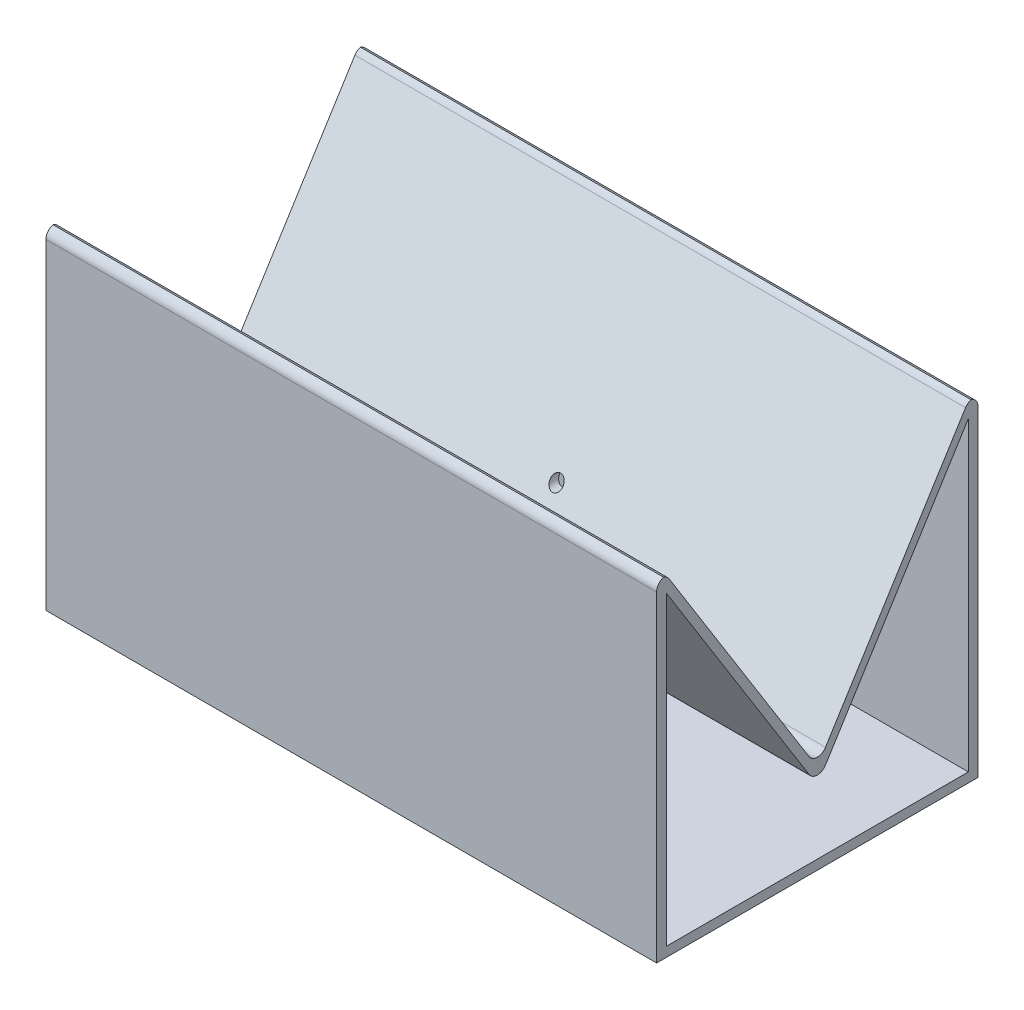
ISO-10303-21;
HEADER;
FILE_DESCRIPTION(('STEP AP214'),'2;1');
FILE_NAME('part.step','',(''),(''),'','','');
FILE_SCHEMA(('AUTOMOTIVE_DESIGN { 1 0 10303 214 1 1 1 1 }'));
ENDSEC;
DATA;
#1=APPLICATION_CONTEXT('core data for automotive mechanical design processes');
#2=APPLICATION_PROTOCOL_DEFINITION('international standard','automotive_design',2000,#1);
#3=PRODUCT_CONTEXT('',#1,'mechanical');
#4=PRODUCT('Part','Part','',(#3));
#5=PRODUCT_RELATED_PRODUCT_CATEGORY('part','',(#4));
#6=PRODUCT_DEFINITION_FORMATION('','',#4);
#7=PRODUCT_DEFINITION_CONTEXT('part definition',#1,'design');
#8=PRODUCT_DEFINITION('design','',#6,#7);
#9=PRODUCT_DEFINITION_SHAPE('','',#8);
#10=(LENGTH_UNIT() NAMED_UNIT(*) SI_UNIT(.MILLI.,.METRE.));
#11=(NAMED_UNIT(*) PLANE_ANGLE_UNIT() SI_UNIT($,.RADIAN.));
#12=(NAMED_UNIT(*) SI_UNIT($,.STERADIAN.) SOLID_ANGLE_UNIT());
#13=UNCERTAINTY_MEASURE_WITH_UNIT(LENGTH_MEASURE(1.E-05),#10,'distance_accuracy_value','');
#14=(GEOMETRIC_REPRESENTATION_CONTEXT(3) GLOBAL_UNCERTAINTY_ASSIGNED_CONTEXT((#13)) GLOBAL_UNIT_ASSIGNED_CONTEXT((#10,
#11,#12)) REPRESENTATION_CONTEXT('',''));
#15=CARTESIAN_POINT('',(0.,0.,0.));
#16=DIRECTION('',(0.,0.,1.));
#17=DIRECTION('',(1.,0.,0.));
#18=AXIS2_PLACEMENT_3D('',#15,#16,#17);
#19=CARTESIAN_POINT('',(0.,3.,0.));
#20=DIRECTION('',(0.,-1.,0.));
#21=DIRECTION('',(0.,0.,-1.));
#22=AXIS2_PLACEMENT_3D('',#19,#20,#21);
#23=PLANE('',#22);
#24=DIRECTION('',(1.,0.,0.));
#25=VECTOR('',#24,1.);
#26=CARTESIAN_POINT('',(-95.,2.99999999999999,-47.));
#27=LINE('',#26,#25);
#28=CARTESIAN_POINT('',(-95.,3.,-47.));
#29=VERTEX_POINT('',#28);
#30=CARTESIAN_POINT('',(95.,3.,-47.));
#31=VERTEX_POINT('',#30);
#32=EDGE_CURVE('E210',#29,#31,#27,.T.);
#33=ORIENTED_EDGE('',*,*,#32,.F.);
#34=DIRECTION('',(0.,0.,1.));
#35=VECTOR('',#34,1.);
#36=CARTESIAN_POINT('',(-95.,3.,50.));
#37=LINE('',#36,#35);
#38=CARTESIAN_POINT('',(-95.,3.,47.));
#39=VERTEX_POINT('',#38);
#40=EDGE_CURVE('E161',#29,#39,#37,.T.);
#41=ORIENTED_EDGE('',*,*,#40,.T.);
#42=DIRECTION('',(1.,0.,0.));
#43=VECTOR('',#42,1.);
#44=CARTESIAN_POINT('',(-95.,3.,47.));
#45=LINE('',#44,#43);
#46=CARTESIAN_POINT('',(95.,3.,47.));
#47=VERTEX_POINT('',#46);
#48=EDGE_CURVE('E165',#39,#47,#45,.T.);
#49=ORIENTED_EDGE('',*,*,#48,.T.);
#50=DIRECTION('',(0.,0.,-1.));
#51=VECTOR('',#50,1.);
#52=CARTESIAN_POINT('',(95.,3.,50.));
#53=LINE('',#52,#51);
#54=EDGE_CURVE('E148',#47,#31,#53,.T.);
#55=ORIENTED_EDGE('',*,*,#54,.T.);
#56=EDGE_LOOP('',(#33,#41,#49,#55));
#57=FACE_BOUND('',#56,.T.);
#58=ADVANCED_FACE('F35',(#57),#23,.F.);
#59=CARTESIAN_POINT('',(95.,3.,50.));
#60=DIRECTION('',(-1.,0.,0.));
#61=DIRECTION('',(0.,0.,1.));
#62=AXIS2_PLACEMENT_3D('',#59,#60,#61);
#63=PLANE('',#62);
#64=DIRECTION('',(0.,-0.847998304005088,-0.52999894000318));
#65=VECTOR('',#64,1.);
#66=CARTESIAN_POINT('',(95.,6.46067415730337,-10.3370786516854));
#67=LINE('',#66,#65);
#68=CARTESIAN_POINT('',(95.,98.2,47.));
#69=VERTEX_POINT('',#68);
#70=CARTESIAN_POINT('',(95.,27.0703918592244,2.54399491201527));
#71=VERTEX_POINT('',#70);
#72=EDGE_CURVE('E174',#69,#71,#67,.T.);
#73=ORIENTED_EDGE('',*,*,#72,.T.);
#74=CARTESIAN_POINT('',(95.,28.660388679234,0.));
#75=DIRECTION('',(-1.,0.,0.));
#76=DIRECTION('',(0.,0.,1.));
#77=AXIS2_PLACEMENT_3D('',#74,#75,#76);
#78=CIRCLE('',#77,3.);
#79=CARTESIAN_POINT('',(95.,27.0703918592244,-2.54399491201526));
#80=VERTEX_POINT('',#79);
#81=EDGE_CURVE('E246',#71,#80,#78,.F.);
#82=ORIENTED_EDGE('',*,*,#81,.T.);
#83=DIRECTION('',(0.,-0.847998304005088,0.52999894000318));
#84=VECTOR('',#83,1.);
#85=CARTESIAN_POINT('',(95.,6.46067415730337,10.3370786516854));
#86=LINE('',#85,#84);
#87=CARTESIAN_POINT('',(95.,98.2,-47.));
#88=VERTEX_POINT('',#87);
#89=EDGE_CURVE('E177',#88,#80,#86,.T.);
#90=ORIENTED_EDGE('',*,*,#89,.F.);
#91=DIRECTION('',(0.,1.,0.));
#92=VECTOR('',#91,1.);
#93=CARTESIAN_POINT('',(95.,0.,-47.));
#94=LINE('',#93,#92);
#95=EDGE_CURVE('E158',#31,#88,#94,.T.);
#96=ORIENTED_EDGE('',*,*,#95,.F.);
#97=ORIENTED_EDGE('',*,*,#54,.F.);
#98=DIRECTION('',(0.,1.,0.));
#99=VECTOR('',#98,1.);
#100=CARTESIAN_POINT('',(95.,0.,47.));
#101=LINE('',#100,#99);
#102=EDGE_CURVE('E154',#47,#69,#101,.T.);
#103=ORIENTED_EDGE('',*,*,#102,.T.);
#104=EDGE_LOOP('',(#73,#82,#90,#96,#97,#103));
#105=FACE_BOUND('',#104,.T.);
#106=CARTESIAN_POINT('',(95.,100.,48.6627429245212));
#107=DIRECTION('',(-1.,0.,0.));
#108=DIRECTION('',(0.,0.,1.));
#109=AXIS2_PLACEMENT_3D('',#106,#107,#108);
#110=CIRCLE('',#109,3.);
#111=CARTESIAN_POINT('',(95.,101.58999682001,46.118748012506));
#112=VERTEX_POINT('',#111);
#113=CARTESIAN_POINT('',(95.,102.882502643839,47.8313714622606));
#114=VERTEX_POINT('',#113);
#115=EDGE_CURVE('E242',#112,#114,#110,.F.);
#116=ORIENTED_EDGE('',*,*,#115,.T.);
#117=CARTESIAN_POINT('',(95.,100.,47.));
#118=DIRECTION('',(-1.,0.,0.));
#119=DIRECTION('',(0.,0.,1.));
#120=AXIS2_PLACEMENT_3D('',#117,#118,#119);
#121=CIRCLE('',#120,3.);
#122=CARTESIAN_POINT('',(95.,100.,50.));
#123=VERTEX_POINT('',#122);
#124=EDGE_CURVE('E244',#114,#123,#121,.F.);
#125=ORIENTED_EDGE('',*,*,#124,.T.);
#126=DIRECTION('',(0.,-1.,0.));
#127=VECTOR('',#126,1.);
#128=CARTESIAN_POINT('',(95.,3.,50.));
#129=LINE('',#128,#127);
#130=CARTESIAN_POINT('',(95.,0.,50.));
#131=VERTEX_POINT('',#130);
#132=EDGE_CURVE('E217',#123,#131,#129,.T.);
#133=ORIENTED_EDGE('',*,*,#132,.T.);
#134=DIRECTION('',(0.,0.,-1.));
#135=VECTOR('',#134,1.);
#136=CARTESIAN_POINT('',(95.,0.,50.));
#137=LINE('',#136,#135);
#138=CARTESIAN_POINT('',(95.,0.,-50.));
#139=VERTEX_POINT('',#138);
#140=EDGE_CURVE('E212',#131,#139,#137,.T.);
#141=ORIENTED_EDGE('',*,*,#140,.T.);
#142=DIRECTION('',(0.,-1.,0.));
#143=VECTOR('',#142,1.);
#144=CARTESIAN_POINT('',(95.,3.,-50.));
#145=LINE('',#144,#143);
#146=CARTESIAN_POINT('',(95.,100.,-50.));
#147=VERTEX_POINT('',#146);
#148=EDGE_CURVE('E233',#147,#139,#145,.T.);
#149=ORIENTED_EDGE('',*,*,#148,.F.);
#150=CARTESIAN_POINT('',(95.,100.,-47.));
#151=DIRECTION('',(-1.,0.,0.));
#152=DIRECTION('',(0.,0.,1.));
#153=AXIS2_PLACEMENT_3D('',#150,#151,#152);
#154=CIRCLE('',#153,3.);
#155=CARTESIAN_POINT('',(95.,102.882502643839,-47.8313714622606));
#156=VERTEX_POINT('',#155);
#157=EDGE_CURVE('E238',#147,#156,#154,.F.);
#158=ORIENTED_EDGE('',*,*,#157,.T.);
#159=CARTESIAN_POINT('',(95.,100.,-48.6627429245212));
#160=DIRECTION('',(-1.,0.,0.));
#161=DIRECTION('',(0.,0.,1.));
#162=AXIS2_PLACEMENT_3D('',#159,#160,#161);
#163=CIRCLE('',#162,3.);
#164=CARTESIAN_POINT('',(95.,101.58999682001,-46.118748012506));
#165=VERTEX_POINT('',#164);
#166=EDGE_CURVE('E240',#156,#165,#163,.F.);
#167=ORIENTED_EDGE('',*,*,#166,.T.);
#168=DIRECTION('',(0.,-0.847998304005088,0.52999894000318));
#169=VECTOR('',#168,1.);
#170=CARTESIAN_POINT('',(95.,7.80898876404495,12.4943820224719));
#171=LINE('',#170,#169);
#172=CARTESIAN_POINT('',(95.,31.8703918592244,-2.54399491201526));
#173=VERTEX_POINT('',#172);
#174=EDGE_CURVE('E189',#165,#173,#171,.T.);
#175=ORIENTED_EDGE('',*,*,#174,.T.);
#176=CARTESIAN_POINT('',(95.,33.460388679234,0.));
#177=DIRECTION('',(-1.,0.,0.));
#178=DIRECTION('',(0.,0.,1.));
#179=AXIS2_PLACEMENT_3D('',#176,#177,#178);
#180=CIRCLE('',#179,3.);
#181=CARTESIAN_POINT('',(95.,31.8703918592244,2.54399491201526));
#182=VERTEX_POINT('',#181);
#183=EDGE_CURVE('E44',#173,#182,#180,.T.);
#184=ORIENTED_EDGE('',*,*,#183,.T.);
#185=DIRECTION('',(0.,-0.847998304005088,-0.52999894000318));
#186=VECTOR('',#185,1.);
#187=CARTESIAN_POINT('',(95.,7.80898876404495,-12.4943820224719));
#188=LINE('',#187,#186);
#189=EDGE_CURVE('E192',#112,#182,#188,.T.);
#190=ORIENTED_EDGE('',*,*,#189,.F.);
#191=EDGE_LOOP('',(#116,#125,#133,#141,#149,#158,#167,#175,#184,#190));
#192=FACE_BOUND('',#191,.T.);
#193=ADVANCED_FACE('F151',(#105,#192),#63,.F.);
#194=CARTESIAN_POINT('',(-95.,3.,-50.));
#195=DIRECTION('',(0.,0.,1.));
#196=DIRECTION('',(1.,0.,0.));
#197=AXIS2_PLACEMENT_3D('',#194,#195,#196);
#198=PLANE('',#197);
#199=DIRECTION('',(0.,-1.,0.));
#200=VECTOR('',#199,1.);
#201=CARTESIAN_POINT('',(-95.,3.,-50.));
#202=LINE('',#201,#200);
#203=CARTESIAN_POINT('',(-95.,100.,-50.));
#204=VERTEX_POINT('',#203);
#205=CARTESIAN_POINT('',(-95.,0.,-50.));
#206=VERTEX_POINT('',#205);
#207=EDGE_CURVE('E231',#204,#206,#202,.T.);
#208=ORIENTED_EDGE('',*,*,#207,.F.);
#209=DIRECTION('',(1.,0.,0.));
#210=VECTOR('',#209,1.);
#211=CARTESIAN_POINT('',(95.,100.,-50.));
#212=LINE('',#211,#210);
#213=EDGE_CURVE('E271',#204,#147,#212,.T.);
#214=ORIENTED_EDGE('',*,*,#213,.T.);
#215=ORIENTED_EDGE('',*,*,#148,.T.);
#216=DIRECTION('',(-1.,0.,0.));
#217=VECTOR('',#216,1.);
#218=CARTESIAN_POINT('',(-95.,0.,-50.));
#219=LINE('',#218,#217);
#220=EDGE_CURVE('E220',#139,#206,#219,.T.);
#221=ORIENTED_EDGE('',*,*,#220,.T.);
#222=EDGE_LOOP('',(#208,#214,#215,#221));
#223=FACE_BOUND('',#222,.T.);
#224=ADVANCED_FACE('F311',(#223),#198,.F.);
#225=CARTESIAN_POINT('',(-95.,3.,50.));
#226=DIRECTION('',(1.,0.,0.));
#227=DIRECTION('',(0.,0.,-1.));
#228=AXIS2_PLACEMENT_3D('',#225,#226,#227);
#229=PLANE('',#228);
#230=DIRECTION('',(0.,-0.847998304005088,0.52999894000318));
#231=VECTOR('',#230,1.);
#232=CARTESIAN_POINT('',(-95.,6.46067415730337,10.3370786516854));
#233=LINE('',#232,#231);
#234=CARTESIAN_POINT('',(-95.,98.2,-47.));
#235=VERTEX_POINT('',#234);
#236=CARTESIAN_POINT('',(-95.,27.0703918592244,-2.54399491201526));
#237=VERTEX_POINT('',#236);
#238=EDGE_CURVE('E200',#235,#237,#233,.T.);
#239=ORIENTED_EDGE('',*,*,#238,.T.);
#240=CARTESIAN_POINT('',(-95.,28.660388679234,0.));
#241=DIRECTION('',(1.,0.,0.));
#242=DIRECTION('',(0.,0.,-1.));
#243=AXIS2_PLACEMENT_3D('',#240,#241,#242);
#244=CIRCLE('',#243,3.);
#245=CARTESIAN_POINT('',(-95.,27.0703918592244,2.54399491201527));
#246=VERTEX_POINT('',#245);
#247=EDGE_CURVE('E256',#237,#246,#244,.F.);
#248=ORIENTED_EDGE('',*,*,#247,.T.);
#249=DIRECTION('',(0.,-0.847998304005088,-0.52999894000318));
#250=VECTOR('',#249,1.);
#251=CARTESIAN_POINT('',(-95.,6.46067415730337,-10.3370786516854));
#252=LINE('',#251,#250);
#253=CARTESIAN_POINT('',(-95.,98.2,47.));
#254=VERTEX_POINT('',#253);
#255=EDGE_CURVE('E197',#254,#246,#252,.T.);
#256=ORIENTED_EDGE('',*,*,#255,.F.);
#257=DIRECTION('',(0.,1.,0.));
#258=VECTOR('',#257,1.);
#259=CARTESIAN_POINT('',(-95.,0.,47.));
#260=LINE('',#259,#258);
#261=EDGE_CURVE('E195',#39,#254,#260,.T.);
#262=ORIENTED_EDGE('',*,*,#261,.F.);
#263=ORIENTED_EDGE('',*,*,#40,.F.);
#264=DIRECTION('',(0.,1.,0.));
#265=VECTOR('',#264,1.);
#266=CARTESIAN_POINT('',(-95.,0.,-47.));
#267=LINE('',#266,#265);
#268=EDGE_CURVE('E203',#29,#235,#267,.T.);
#269=ORIENTED_EDGE('',*,*,#268,.T.);
#270=EDGE_LOOP('',(#239,#248,#256,#262,#263,#269));
#271=FACE_BOUND('',#270,.T.);
#272=DIRECTION('',(0.,-1.,0.));
#273=VECTOR('',#272,1.);
#274=CARTESIAN_POINT('',(-95.,3.,50.));
#275=LINE('',#274,#273);
#276=CARTESIAN_POINT('',(-95.,100.,50.));
#277=VERTEX_POINT('',#276);
#278=CARTESIAN_POINT('',(-95.,0.,50.));
#279=VERTEX_POINT('',#278);
#280=EDGE_CURVE('E229',#277,#279,#275,.T.);
#281=ORIENTED_EDGE('',*,*,#280,.F.);
#282=CARTESIAN_POINT('',(-95.,100.,47.));
#283=DIRECTION('',(1.,0.,0.));
#284=DIRECTION('',(0.,0.,-1.));
#285=AXIS2_PLACEMENT_3D('',#282,#283,#284);
#286=CIRCLE('',#285,3.);
#287=CARTESIAN_POINT('',(-95.,102.882502643839,47.8313714622606));
#288=VERTEX_POINT('',#287);
#289=EDGE_CURVE('E52',#277,#288,#286,.F.);
#290=ORIENTED_EDGE('',*,*,#289,.T.);
#291=CARTESIAN_POINT('',(-95.,100.,48.6627429245212));
#292=DIRECTION('',(1.,0.,0.));
#293=DIRECTION('',(0.,0.,-1.));
#294=AXIS2_PLACEMENT_3D('',#291,#292,#293);
#295=CIRCLE('',#294,3.);
#296=CARTESIAN_POINT('',(-95.,101.58999682001,46.118748012506));
#297=VERTEX_POINT('',#296);
#298=EDGE_CURVE('E253',#288,#297,#295,.F.);
#299=ORIENTED_EDGE('',*,*,#298,.T.);
#300=DIRECTION('',(0.,-0.847998304005088,-0.52999894000318));
#301=VECTOR('',#300,1.);
#302=CARTESIAN_POINT('',(-95.,7.80898876404495,-12.4943820224719));
#303=LINE('',#302,#301);
#304=CARTESIAN_POINT('',(-95.,31.8703918592244,2.54399491201526));
#305=VERTEX_POINT('',#304);
#306=EDGE_CURVE('E171',#297,#305,#303,.T.);
#307=ORIENTED_EDGE('',*,*,#306,.T.);
#308=CARTESIAN_POINT('',(-95.,33.460388679234,0.));
#309=DIRECTION('',(1.,0.,0.));
#310=DIRECTION('',(0.,0.,-1.));
#311=AXIS2_PLACEMENT_3D('',#308,#309,#310);
#312=CIRCLE('',#311,3.);
#313=CARTESIAN_POINT('',(-95.,31.8703918592244,-2.54399491201526));
#314=VERTEX_POINT('',#313);
#315=EDGE_CURVE('E11',#305,#314,#312,.T.);
#316=ORIENTED_EDGE('',*,*,#315,.T.);
#317=DIRECTION('',(0.,-0.847998304005088,0.52999894000318));
#318=VECTOR('',#317,1.);
#319=CARTESIAN_POINT('',(-95.,7.80898876404495,12.4943820224719));
#320=LINE('',#319,#318);
#321=CARTESIAN_POINT('',(-95.,101.58999682001,-46.118748012506));
#322=VERTEX_POINT('',#321);
#323=EDGE_CURVE('E205',#322,#314,#320,.T.);
#324=ORIENTED_EDGE('',*,*,#323,.F.);
#325=CARTESIAN_POINT('',(-95.,100.,-48.6627429245212));
#326=DIRECTION('',(1.,0.,0.));
#327=DIRECTION('',(0.,0.,-1.));
#328=AXIS2_PLACEMENT_3D('',#325,#326,#327);
#329=CIRCLE('',#328,3.);
#330=CARTESIAN_POINT('',(-95.,102.882502643839,-47.8313714622606));
#331=VERTEX_POINT('',#330);
#332=EDGE_CURVE('E59',#322,#331,#329,.F.);
#333=ORIENTED_EDGE('',*,*,#332,.T.);
#334=CARTESIAN_POINT('',(-95.,100.,-47.));
#335=DIRECTION('',(1.,0.,0.));
#336=DIRECTION('',(0.,0.,-1.));
#337=AXIS2_PLACEMENT_3D('',#334,#335,#336);
#338=CIRCLE('',#337,3.);
#339=EDGE_CURVE('E250',#331,#204,#338,.F.);
#340=ORIENTED_EDGE('',*,*,#339,.T.);
#341=ORIENTED_EDGE('',*,*,#207,.T.);
#342=DIRECTION('',(0.,0.,1.));
#343=VECTOR('',#342,1.);
#344=CARTESIAN_POINT('',(-95.,0.,50.));
#345=LINE('',#344,#343);
#346=EDGE_CURVE('E223',#206,#279,#345,.T.);
#347=ORIENTED_EDGE('',*,*,#346,.T.);
#348=EDGE_LOOP('',(#281,#290,#299,#307,#316,#324,#333,#340,#341,#347));
#349=FACE_BOUND('',#348,.T.);
#350=ADVANCED_FACE('F324',(#271,#349),#229,.F.);
#351=CARTESIAN_POINT('',(-95.,3.,50.));
#352=DIRECTION('',(0.,0.,-1.));
#353=DIRECTION('',(-1.,0.,0.));
#354=AXIS2_PLACEMENT_3D('',#351,#352,#353);
#355=PLANE('',#354);
#356=ORIENTED_EDGE('',*,*,#132,.F.);
#357=DIRECTION('',(1.,0.,0.));
#358=VECTOR('',#357,1.);
#359=CARTESIAN_POINT('',(-95.,100.,50.));
#360=LINE('',#359,#358);
#361=EDGE_CURVE('E258',#123,#277,#360,.F.);
#362=ORIENTED_EDGE('',*,*,#361,.T.);
#363=ORIENTED_EDGE('',*,*,#280,.T.);
#364=DIRECTION('',(1.,0.,0.));
#365=VECTOR('',#364,1.);
#366=CARTESIAN_POINT('',(-95.,0.,50.));
#367=LINE('',#366,#365);
#368=EDGE_CURVE('E162',#279,#131,#367,.T.);
#369=ORIENTED_EDGE('',*,*,#368,.T.);
#370=EDGE_LOOP('',(#356,#362,#363,#369));
#371=FACE_BOUND('',#370,.T.);
#372=ADVANCED_FACE('F320',(#371),#355,.F.);
#373=CARTESIAN_POINT('',(0.,0.,0.));
#374=DIRECTION('',(0.,-1.,0.));
#375=DIRECTION('',(0.,0.,-1.));
#376=AXIS2_PLACEMENT_3D('',#373,#374,#375);
#377=PLANE('',#376);
#378=ORIENTED_EDGE('',*,*,#140,.F.);
#379=ORIENTED_EDGE('',*,*,#368,.F.);
#380=ORIENTED_EDGE('',*,*,#346,.F.);
#381=ORIENTED_EDGE('',*,*,#220,.F.);
#382=EDGE_LOOP('',(#378,#379,#380,#381));
#383=FACE_BOUND('',#382,.T.);
#384=ADVANCED_FACE('F316',(#383),#377,.T.);
#385=CARTESIAN_POINT('',(-95.,7.80898876404495,-12.4943820224719));
#386=DIRECTION('',(0.,-0.52999894000318,0.847998304005088));
#387=DIRECTION('',(0.,-0.847998304005088,-0.52999894000318));
#388=AXIS2_PLACEMENT_3D('',#385,#386,#387);
#389=PLANE('',#388);
#390=CARTESIAN_POINT('',(0.,50.,13.875));
#391=DIRECTION('',(0.,-0.52999894000318,0.847998304005088));
#392=DIRECTION('',(0.,-0.847998304005088,-0.52999894000318));
#393=AXIS2_PLACEMENT_3D('',#390,#391,#392);
#394=ELLIPSE('',#393,2.35849528301415,2.);
#395=CARTESIAN_POINT('',(0.,48.,12.625));
#396=VERTEX_POINT('',#395);
#397=EDGE_CURVE('E183',#396,#396,#394,.F.);
#398=ORIENTED_EDGE('',*,*,#397,.F.);
#399=EDGE_LOOP('',(#398));
#400=FACE_BOUND('',#399,.T.);
#401=ORIENTED_EDGE('',*,*,#306,.F.);
#402=DIRECTION('',(1.,0.,0.));
#403=VECTOR('',#402,1.);
#404=CARTESIAN_POINT('',(-95.,101.58999682001,46.118748012506));
#405=LINE('',#404,#403);
#406=EDGE_CURVE('E263',#297,#112,#405,.T.);
#407=ORIENTED_EDGE('',*,*,#406,.T.);
#408=ORIENTED_EDGE('',*,*,#189,.T.);
#409=DIRECTION('',(1.,0.,0.));
#410=VECTOR('',#409,1.);
#411=CARTESIAN_POINT('',(-95.,31.8703918592244,2.54399491201526));
#412=LINE('',#411,#410);
#413=EDGE_CURVE('E261',#182,#305,#412,.F.);
#414=ORIENTED_EDGE('',*,*,#413,.T.);
#415=EDGE_LOOP('',(#401,#407,#408,#414));
#416=FACE_BOUND('',#415,.T.);
#417=ADVANCED_FACE('F319',(#400,#416),#389,.F.);
#418=CARTESIAN_POINT('',(-95.,7.80898876404495,12.4943820224719));
#419=DIRECTION('',(0.,0.52999894000318,0.847998304005088));
#420=DIRECTION('',(0.,-0.847998304005088,0.52999894000318));
#421=AXIS2_PLACEMENT_3D('',#418,#419,#420);
#422=PLANE('',#421);
#423=CARTESIAN_POINT('',(0.,50.,-13.875));
#424=DIRECTION('',(0.,0.52999894000318,0.847998304005088));
#425=DIRECTION('',(0.,0.847998304005088,-0.52999894000318));
#426=AXIS2_PLACEMENT_3D('',#423,#424,#425);
#427=ELLIPSE('',#426,2.35849528301415,2.);
#428=CARTESIAN_POINT('',(0.,52.,-15.125));
#429=VERTEX_POINT('',#428);
#430=EDGE_CURVE('E278',#429,#429,#427,.F.);
#431=ORIENTED_EDGE('',*,*,#430,.T.);
#432=EDGE_LOOP('',(#431));
#433=FACE_BOUND('',#432,.T.);
#434=ORIENTED_EDGE('',*,*,#323,.T.);
#435=DIRECTION('',(1.,0.,0.));
#436=VECTOR('',#435,1.);
#437=CARTESIAN_POINT('',(-95.,31.8703918592244,-2.54399491201526));
#438=LINE('',#437,#436);
#439=EDGE_CURVE('E268',#314,#173,#438,.T.);
#440=ORIENTED_EDGE('',*,*,#439,.T.);
#441=ORIENTED_EDGE('',*,*,#174,.F.);
#442=DIRECTION('',(1.,0.,0.));
#443=VECTOR('',#442,1.);
#444=CARTESIAN_POINT('',(-95.,101.58999682001,-46.118748012506));
#445=LINE('',#444,#443);
#446=EDGE_CURVE('E265',#165,#322,#445,.F.);
#447=ORIENTED_EDGE('',*,*,#446,.T.);
#448=EDGE_LOOP('',(#434,#440,#441,#447));
#449=FACE_BOUND('',#448,.T.);
#450=ADVANCED_FACE('F356',(#433,#449),#422,.T.);
#451=CARTESIAN_POINT('',(-95.,0.,-47.));
#452=DIRECTION('',(0.,0.,-1.));
#453=DIRECTION('',(0.,1.,0.));
#454=AXIS2_PLACEMENT_3D('',#451,#452,#453);
#455=PLANE('',#454);
#456=ORIENTED_EDGE('',*,*,#32,.T.);
#457=ORIENTED_EDGE('',*,*,#95,.T.);
#458=DIRECTION('',(1.,0.,0.));
#459=VECTOR('',#458,1.);
#460=CARTESIAN_POINT('',(-95.,98.2,-47.));
#461=LINE('',#460,#459);
#462=EDGE_CURVE('E213',#235,#88,#461,.T.);
#463=ORIENTED_EDGE('',*,*,#462,.F.);
#464=ORIENTED_EDGE('',*,*,#268,.F.);
#465=EDGE_LOOP('',(#456,#457,#463,#464));
#466=FACE_BOUND('',#465,.T.);
#467=ADVANCED_FACE('F381',(#466),#455,.F.);
#468=CARTESIAN_POINT('',(-95.,6.46067415730337,10.3370786516854));
#469=DIRECTION('',(0.,0.52999894000318,0.847998304005088));
#470=DIRECTION('',(0.,-0.847998304005088,0.52999894000318));
#471=AXIS2_PLACEMENT_3D('',#468,#469,#470);
#472=PLANE('',#471);
#473=CARTESIAN_POINT('',(0.,50.,-16.875));
#474=DIRECTION('',(0.,0.52999894000318,0.847998304005088));
#475=DIRECTION('',(0.,0.847998304005088,-0.52999894000318));
#476=AXIS2_PLACEMENT_3D('',#473,#474,#475);
#477=ELLIPSE('',#476,2.35849528301415,2.);
#478=CARTESIAN_POINT('',(0.,52.,-18.125));
#479=VERTEX_POINT('',#478);
#480=EDGE_CURVE('E282',#479,#479,#477,.F.);
#481=ORIENTED_EDGE('',*,*,#480,.F.);
#482=EDGE_LOOP('',(#481));
#483=FACE_BOUND('',#482,.T.);
#484=ORIENTED_EDGE('',*,*,#89,.T.);
#485=DIRECTION('',(1.,0.,0.));
#486=VECTOR('',#485,1.);
#487=CARTESIAN_POINT('',(-95.,27.0703918592244,-2.54399491201526));
#488=LINE('',#487,#486);
#489=EDGE_CURVE('E248',#80,#237,#488,.F.);
#490=ORIENTED_EDGE('',*,*,#489,.T.);
#491=ORIENTED_EDGE('',*,*,#238,.F.);
#492=ORIENTED_EDGE('',*,*,#462,.T.);
#493=EDGE_LOOP('',(#484,#490,#491,#492));
#494=FACE_BOUND('',#493,.T.);
#495=ADVANCED_FACE('F386',(#483,#494),#472,.F.);
#496=CARTESIAN_POINT('',(-95.,6.46067415730337,-10.3370786516854));
#497=DIRECTION('',(0.,-0.52999894000318,0.847998304005088));
#498=DIRECTION('',(0.,-0.847998304005088,-0.52999894000318));
#499=AXIS2_PLACEMENT_3D('',#496,#497,#498);
#500=PLANE('',#499);
#501=CARTESIAN_POINT('',(0.,50.,16.875));
#502=DIRECTION('',(0.,-0.52999894000318,0.847998304005088));
#503=DIRECTION('',(0.,-0.847998304005088,-0.52999894000318));
#504=AXIS2_PLACEMENT_3D('',#501,#502,#503);
#505=ELLIPSE('',#504,2.35849528301415,2.);
#506=CARTESIAN_POINT('',(0.,48.,15.625));
#507=VERTEX_POINT('',#506);
#508=EDGE_CURVE('E39',#507,#507,#505,.F.);
#509=ORIENTED_EDGE('',*,*,#508,.T.);
#510=EDGE_LOOP('',(#509));
#511=FACE_BOUND('',#510,.T.);
#512=ORIENTED_EDGE('',*,*,#255,.T.);
#513=DIRECTION('',(1.,0.,0.));
#514=VECTOR('',#513,1.);
#515=CARTESIAN_POINT('',(95.,27.0703918592244,2.54399491201527));
#516=LINE('',#515,#514);
#517=EDGE_CURVE('E235',#246,#71,#516,.T.);
#518=ORIENTED_EDGE('',*,*,#517,.T.);
#519=ORIENTED_EDGE('',*,*,#72,.F.);
#520=DIRECTION('',(1.,0.,0.));
#521=VECTOR('',#520,1.);
#522=CARTESIAN_POINT('',(-95.,98.2,47.));
#523=LINE('',#522,#521);
#524=EDGE_CURVE('E170',#254,#69,#523,.T.);
#525=ORIENTED_EDGE('',*,*,#524,.F.);
#526=EDGE_LOOP('',(#512,#518,#519,#525));
#527=FACE_BOUND('',#526,.T.);
#528=ADVANCED_FACE('F292',(#511,#527),#500,.T.);
#529=CARTESIAN_POINT('',(-95.,0.,47.));
#530=DIRECTION('',(0.,0.,-1.));
#531=DIRECTION('',(-1.,0.,0.));
#532=AXIS2_PLACEMENT_3D('',#529,#530,#531);
#533=PLANE('',#532);
#534=ORIENTED_EDGE('',*,*,#524,.T.);
#535=ORIENTED_EDGE('',*,*,#102,.F.);
#536=ORIENTED_EDGE('',*,*,#48,.F.);
#537=ORIENTED_EDGE('',*,*,#261,.T.);
#538=EDGE_LOOP('',(#534,#535,#536,#537));
#539=FACE_BOUND('',#538,.T.);
#540=ADVANCED_FACE('F173',(#539),#533,.T.);
#541=CARTESIAN_POINT('',(-95.,28.660388679234,0.));
#542=DIRECTION('',(-1.,0.,0.));
#543=DIRECTION('',(0.,0.,1.));
#544=AXIS2_PLACEMENT_3D('',#541,#542,#543);
#545=CYLINDRICAL_SURFACE('',#544,3.);
#546=ORIENTED_EDGE('',*,*,#247,.F.);
#547=ORIENTED_EDGE('',*,*,#489,.F.);
#548=ORIENTED_EDGE('',*,*,#81,.F.);
#549=ORIENTED_EDGE('',*,*,#517,.F.);
#550=EDGE_LOOP('',(#546,#547,#548,#549));
#551=FACE_BOUND('',#550,.T.);
#552=ADVANCED_FACE('F332',(#551),#545,.T.);
#553=CARTESIAN_POINT('',(-95.,100.,48.6627429245212));
#554=DIRECTION('',(1.,0.,0.));
#555=DIRECTION('',(0.,0.,-1.));
#556=AXIS2_PLACEMENT_3D('',#553,#554,#555);
#557=CYLINDRICAL_SURFACE('',#556,3.);
#558=ORIENTED_EDGE('',*,*,#406,.F.);
#559=ORIENTED_EDGE('',*,*,#298,.F.);
#560=DIRECTION('',(1.,0.,0.));
#561=VECTOR('',#560,1.);
#562=CARTESIAN_POINT('',(0.,102.882502643839,47.8313714622606));
#563=LINE('',#562,#561);
#564=EDGE_CURVE('E175',#114,#288,#563,.F.);
#565=ORIENTED_EDGE('',*,*,#564,.F.);
#566=ORIENTED_EDGE('',*,*,#115,.F.);
#567=EDGE_LOOP('',(#558,#559,#565,#566));
#568=FACE_BOUND('',#567,.T.);
#569=ADVANCED_FACE('F335',(#568),#557,.T.);
#570=CARTESIAN_POINT('',(-95.,100.,47.));
#571=DIRECTION('',(1.,0.,0.));
#572=DIRECTION('',(0.,0.,-1.));
#573=AXIS2_PLACEMENT_3D('',#570,#571,#572);
#574=CYLINDRICAL_SURFACE('',#573,3.);
#575=ORIENTED_EDGE('',*,*,#289,.F.);
#576=ORIENTED_EDGE('',*,*,#361,.F.);
#577=ORIENTED_EDGE('',*,*,#124,.F.);
#578=ORIENTED_EDGE('',*,*,#564,.T.);
#579=EDGE_LOOP('',(#575,#576,#577,#578));
#580=FACE_BOUND('',#579,.T.);
#581=ADVANCED_FACE('F337',(#580),#574,.T.);
#582=CARTESIAN_POINT('',(-95.,33.460388679234,0.));
#583=DIRECTION('',(1.,0.,0.));
#584=DIRECTION('',(0.,0.,-1.));
#585=AXIS2_PLACEMENT_3D('',#582,#583,#584);
#586=CYLINDRICAL_SURFACE('',#585,3.);
#587=ORIENTED_EDGE('',*,*,#315,.F.);
#588=ORIENTED_EDGE('',*,*,#413,.F.);
#589=ORIENTED_EDGE('',*,*,#183,.F.);
#590=ORIENTED_EDGE('',*,*,#439,.F.);
#591=EDGE_LOOP('',(#587,#588,#589,#590));
#592=FACE_BOUND('',#591,.T.);
#593=ADVANCED_FACE('F340',(#592),#586,.F.);
#594=CARTESIAN_POINT('',(-95.,100.,-47.));
#595=DIRECTION('',(-1.,0.,0.));
#596=DIRECTION('',(0.,0.,1.));
#597=AXIS2_PLACEMENT_3D('',#594,#595,#596);
#598=CYLINDRICAL_SURFACE('',#597,3.);
#599=ORIENTED_EDGE('',*,*,#213,.F.);
#600=ORIENTED_EDGE('',*,*,#339,.F.);
#601=DIRECTION('',(-1.,0.,0.));
#602=VECTOR('',#601,1.);
#603=CARTESIAN_POINT('',(0.,102.882502643839,-47.8313714622606));
#604=LINE('',#603,#602);
#605=EDGE_CURVE('E180',#156,#331,#604,.T.);
#606=ORIENTED_EDGE('',*,*,#605,.F.);
#607=ORIENTED_EDGE('',*,*,#157,.F.);
#608=EDGE_LOOP('',(#599,#600,#606,#607));
#609=FACE_BOUND('',#608,.T.);
#610=ADVANCED_FACE('F37',(#609),#598,.T.);
#611=CARTESIAN_POINT('',(-95.,100.,-48.6627429245212));
#612=DIRECTION('',(1.,0.,0.));
#613=DIRECTION('',(0.,0.,-1.));
#614=AXIS2_PLACEMENT_3D('',#611,#612,#613);
#615=CYLINDRICAL_SURFACE('',#614,3.);
#616=ORIENTED_EDGE('',*,*,#332,.F.);
#617=ORIENTED_EDGE('',*,*,#446,.F.);
#618=ORIENTED_EDGE('',*,*,#166,.F.);
#619=ORIENTED_EDGE('',*,*,#605,.T.);
#620=EDGE_LOOP('',(#616,#617,#618,#619));
#621=FACE_BOUND('',#620,.T.);
#622=ADVANCED_FACE('F298',(#621),#615,.T.);
#623=CARTESIAN_POINT('',(0.,50.,30.));
#624=DIRECTION('',(0.,0.,-1.));
#625=DIRECTION('',(-1.,0.,0.));
#626=AXIS2_PLACEMENT_3D('',#623,#624,#625);
#627=CYLINDRICAL_SURFACE('',#626,2.);
#628=ORIENTED_EDGE('',*,*,#508,.F.);
#629=EDGE_LOOP('',(#628));
#630=FACE_BOUND('',#629,.T.);
#631=ORIENTED_EDGE('',*,*,#397,.T.);
#632=EDGE_LOOP('',(#631));
#633=FACE_BOUND('',#632,.T.);
#634=ADVANCED_FACE('F295',(#630,#633),#627,.F.);
#635=ORIENTED_EDGE('',*,*,#430,.F.);
#636=EDGE_LOOP('',(#635));
#637=FACE_BOUND('',#636,.T.);
#638=ORIENTED_EDGE('',*,*,#480,.T.);
#639=EDGE_LOOP('',(#638));
#640=FACE_BOUND('',#639,.T.);
#641=ADVANCED_FACE('F297',(#637,#640),#627,.F.);
#642=CLOSED_SHELL('',(#58,#193,#224,#350,#372,#384,#417,#450,#467,#495,#528,#540,#552,#569,#581,
#593,#610,#622,#634,#641));
#643=MANIFOLD_SOLID_BREP('B2',#642);
#644=ADVANCED_BREP_SHAPE_REPRESENTATION('',(#18,#643),#14);
#645=SHAPE_DEFINITION_REPRESENTATION(#9,#644);
ENDSEC;
END-ISO-10303-21;
